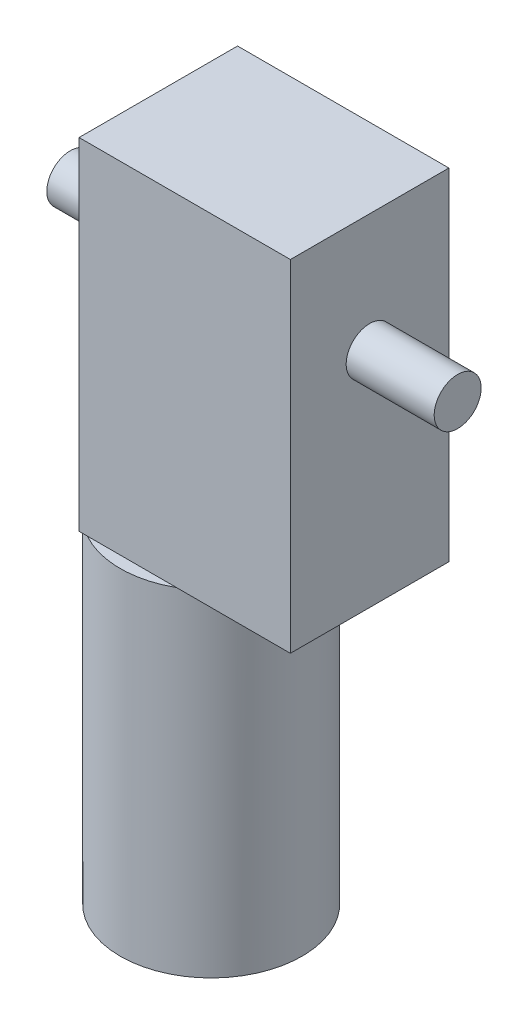
ISO-10303-21;
HEADER;
FILE_DESCRIPTION(('STEP AP214'),'2;1');
FILE_NAME('part.step','',(''),(''),'','','');
FILE_SCHEMA(('AUTOMOTIVE_DESIGN { 1 0 10303 214 1 1 1 1 }'));
ENDSEC;
DATA;
#1=APPLICATION_CONTEXT('core data for automotive mechanical design processes');
#2=APPLICATION_PROTOCOL_DEFINITION('international standard','automotive_design',2000,#1);
#3=PRODUCT_CONTEXT('',#1,'mechanical');
#4=PRODUCT('Part','Part','',(#3));
#5=PRODUCT_RELATED_PRODUCT_CATEGORY('part','',(#4));
#6=PRODUCT_DEFINITION_FORMATION('','',#4);
#7=PRODUCT_DEFINITION_CONTEXT('part definition',#1,'design');
#8=PRODUCT_DEFINITION('design','',#6,#7);
#9=PRODUCT_DEFINITION_SHAPE('','',#8);
#10=(LENGTH_UNIT() NAMED_UNIT(*) SI_UNIT(.MILLI.,.METRE.));
#11=(NAMED_UNIT(*) PLANE_ANGLE_UNIT() SI_UNIT($,.RADIAN.));
#12=(NAMED_UNIT(*) SI_UNIT($,.STERADIAN.) SOLID_ANGLE_UNIT());
#13=UNCERTAINTY_MEASURE_WITH_UNIT(LENGTH_MEASURE(1.E-05),#10,'distance_accuracy_value','');
#14=(GEOMETRIC_REPRESENTATION_CONTEXT(3) GLOBAL_UNCERTAINTY_ASSIGNED_CONTEXT((#13)) GLOBAL_UNIT_ASSIGNED_CONTEXT((#10,
#11,#12)) REPRESENTATION_CONTEXT('',''));
#15=CARTESIAN_POINT('',(0.,0.,0.));
#16=DIRECTION('',(0.,0.,1.));
#17=DIRECTION('',(1.,0.,0.));
#18=AXIS2_PLACEMENT_3D('',#15,#16,#17);
#19=CARTESIAN_POINT('',(0.,57.2,0.));
#20=DIRECTION('',(0.,1.,0.));
#21=DIRECTION('',(0.,0.,1.));
#22=AXIS2_PLACEMENT_3D('',#19,#20,#21);
#23=PLANE('',#22);
#24=DIRECTION('',(0.,0.,1.));
#25=VECTOR('',#24,1.);
#26=CARTESIAN_POINT('',(-9.00000000000001,57.2,-13.5));
#27=LINE('',#26,#25);
#28=CARTESIAN_POINT('',(-9.00000000000001,57.2,-12.6120591498772));
#29=VERTEX_POINT('',#28);
#30=CARTESIAN_POINT('',(-9.,57.2,12.6120591498772));
#31=VERTEX_POINT('',#30);
#32=EDGE_CURVE('E11',#29,#31,#27,.T.);
#33=ORIENTED_EDGE('',*,*,#32,.F.);
#34=CARTESIAN_POINT('',(0.,57.2,0.));
#35=DIRECTION('',(0.,1.,0.));
#36=DIRECTION('',(0.,0.,1.));
#37=AXIS2_PLACEMENT_3D('',#34,#35,#36);
#38=CIRCLE('',#37,15.494);
#39=EDGE_CURVE('E145',#29,#31,#38,.T.);
#40=ORIENTED_EDGE('',*,*,#39,.T.);
#41=EDGE_LOOP('',(#33,#40));
#42=FACE_BOUND('',#41,.T.);
#43=ADVANCED_FACE('F34',(#42),#23,.T.);
#44=DIRECTION('',(-1.,0.,0.));
#45=VECTOR('',#44,1.);
#46=CARTESIAN_POINT('',(-9.00000000000001,57.2,-13.5));
#47=LINE('',#46,#45);
#48=CARTESIAN_POINT('',(7.60355416893967,57.2,-13.5));
#49=VERTEX_POINT('',#48);
#50=CARTESIAN_POINT('',(-7.60355416893968,57.2,-13.5));
#51=VERTEX_POINT('',#50);
#52=EDGE_CURVE('E43',#49,#51,#47,.T.);
#53=ORIENTED_EDGE('',*,*,#52,.F.);
#54=EDGE_CURVE('E135',#49,#51,#38,.T.);
#55=ORIENTED_EDGE('',*,*,#54,.T.);
#56=EDGE_LOOP('',(#53,#55));
#57=FACE_BOUND('',#56,.T.);
#58=ADVANCED_FACE('F201',(#57),#23,.T.);
#59=CARTESIAN_POINT('',(0.,57.2,0.));
#60=DIRECTION('',(0.,-1.,0.));
#61=DIRECTION('',(0.,0.,-1.));
#62=AXIS2_PLACEMENT_3D('',#59,#60,#61);
#63=CYLINDRICAL_SURFACE('',#62,15.494);
#64=CARTESIAN_POINT('',(7.60355416893969,57.2,13.5));
#65=VERTEX_POINT('',#64);
#66=EDGE_CURVE('E133',#65,#49,#38,.T.);
#67=ORIENTED_EDGE('',*,*,#66,.F.);
#68=CARTESIAN_POINT('',(-7.60355416893969,57.2,13.5));
#69=VERTEX_POINT('',#68);
#70=EDGE_CURVE('E128',#69,#65,#38,.T.);
#71=ORIENTED_EDGE('',*,*,#70,.F.);
#72=EDGE_CURVE('E59',#31,#69,#38,.T.);
#73=ORIENTED_EDGE('',*,*,#72,.F.);
#74=ORIENTED_EDGE('',*,*,#39,.F.);
#75=EDGE_CURVE('E144',#51,#29,#38,.T.);
#76=ORIENTED_EDGE('',*,*,#75,.F.);
#77=ORIENTED_EDGE('',*,*,#54,.F.);
#78=EDGE_LOOP('',(#67,#71,#73,#74,#76,#77));
#79=FACE_BOUND('',#78,.T.);
#80=CARTESIAN_POINT('',(0.,0.,0.));
#81=DIRECTION('',(0.,1.,0.));
#82=DIRECTION('',(0.,0.,1.));
#83=AXIS2_PLACEMENT_3D('',#80,#81,#82);
#84=CIRCLE('',#83,15.494);
#85=CARTESIAN_POINT('',(0.,0.,15.494));
#86=VERTEX_POINT('',#85);
#87=EDGE_CURVE('E125',#86,#86,#84,.T.);
#88=ORIENTED_EDGE('',*,*,#87,.T.);
#89=EDGE_LOOP('',(#88));
#90=FACE_BOUND('',#89,.T.);
#91=ADVANCED_FACE('F36',(#79,#90),#63,.T.);
#92=DIRECTION('',(1.,0.,0.));
#93=VECTOR('',#92,1.);
#94=CARTESIAN_POINT('',(-9.,57.2,13.5));
#95=LINE('',#94,#93);
#96=EDGE_CURVE('E52',#69,#65,#95,.T.);
#97=ORIENTED_EDGE('',*,*,#96,.F.);
#98=ORIENTED_EDGE('',*,*,#70,.T.);
#99=EDGE_LOOP('',(#97,#98));
#100=FACE_BOUND('',#99,.T.);
#101=ADVANCED_FACE('F203',(#100),#23,.T.);
#102=CARTESIAN_POINT('',(0.,0.,0.));
#103=DIRECTION('',(0.,1.,0.));
#104=DIRECTION('',(0.,0.,1.));
#105=AXIS2_PLACEMENT_3D('',#102,#103,#104);
#106=PLANE('',#105);
#107=ORIENTED_EDGE('',*,*,#87,.F.);
#108=EDGE_LOOP('',(#107));
#109=FACE_BOUND('',#108,.T.);
#110=ADVANCED_FACE('F210',(#109),#106,.F.);
#111=CARTESIAN_POINT('',(0.,57.2,0.));
#112=DIRECTION('',(0.,1.,0.));
#113=DIRECTION('',(0.,0.,1.));
#114=AXIS2_PLACEMENT_3D('',#111,#112,#113);
#115=PLANE('',#114);
#116=CARTESIAN_POINT('',(27.,57.2,13.5));
#117=VERTEX_POINT('',#116);
#118=EDGE_CURVE('E142',#65,#117,#95,.T.);
#119=ORIENTED_EDGE('',*,*,#118,.F.);
#120=ORIENTED_EDGE('',*,*,#66,.T.);
#121=CARTESIAN_POINT('',(27.,57.2,-13.5));
#122=VERTEX_POINT('',#121);
#123=EDGE_CURVE('E119',#122,#49,#47,.T.);
#124=ORIENTED_EDGE('',*,*,#123,.F.);
#125=DIRECTION('',(0.,0.,-1.));
#126=VECTOR('',#125,1.);
#127=CARTESIAN_POINT('',(27.,57.2,-13.5));
#128=LINE('',#127,#126);
#129=EDGE_CURVE('E161',#117,#122,#128,.T.);
#130=ORIENTED_EDGE('',*,*,#129,.F.);
#131=EDGE_LOOP('',(#119,#120,#124,#130));
#132=FACE_BOUND('',#131,.T.);
#133=ADVANCED_FACE('F170',(#132),#115,.F.);
#134=CARTESIAN_POINT('',(-9.00000000000001,57.2,-13.5));
#135=VERTEX_POINT('',#134);
#136=EDGE_CURVE('E153',#51,#135,#47,.T.);
#137=ORIENTED_EDGE('',*,*,#136,.F.);
#138=ORIENTED_EDGE('',*,*,#75,.T.);
#139=EDGE_CURVE('E45',#135,#29,#27,.T.);
#140=ORIENTED_EDGE('',*,*,#139,.F.);
#141=EDGE_LOOP('',(#137,#138,#140));
#142=FACE_BOUND('',#141,.T.);
#143=ADVANCED_FACE('F152',(#142),#115,.F.);
#144=CARTESIAN_POINT('',(-9.,57.2,13.5));
#145=VERTEX_POINT('',#144);
#146=EDGE_CURVE('E46',#31,#145,#27,.T.);
#147=ORIENTED_EDGE('',*,*,#146,.F.);
#148=ORIENTED_EDGE('',*,*,#72,.T.);
#149=EDGE_CURVE('E141',#145,#69,#95,.T.);
#150=ORIENTED_EDGE('',*,*,#149,.F.);
#151=EDGE_LOOP('',(#147,#148,#150));
#152=FACE_BOUND('',#151,.T.);
#153=ADVANCED_FACE('F245',(#152),#115,.F.);
#154=CARTESIAN_POINT('',(-9.00000000000001,115.3,-13.5));
#155=DIRECTION('',(1.,0.,0.));
#156=DIRECTION('',(0.,0.,-1.));
#157=AXIS2_PLACEMENT_3D('',#154,#155,#156);
#158=PLANE('',#157);
#159=CARTESIAN_POINT('',(-9.,95.1,0.));
#160=DIRECTION('',(1.,0.,0.));
#161=DIRECTION('',(0.,0.,-1.));
#162=AXIS2_PLACEMENT_3D('',#159,#160,#161);
#163=CIRCLE('',#162,4.);
#164=CARTESIAN_POINT('',(-9.,95.1,-4.));
#165=VERTEX_POINT('',#164);
#166=EDGE_CURVE('E157',#165,#165,#163,.T.);
#167=ORIENTED_EDGE('',*,*,#166,.T.);
#168=EDGE_LOOP('',(#167));
#169=FACE_BOUND('',#168,.T.);
#170=ORIENTED_EDGE('',*,*,#139,.T.);
#171=ORIENTED_EDGE('',*,*,#32,.T.);
#172=ORIENTED_EDGE('',*,*,#146,.T.);
#173=DIRECTION('',(0.,-1.,0.));
#174=VECTOR('',#173,1.);
#175=CARTESIAN_POINT('',(-9.,115.3,13.5));
#176=LINE('',#175,#174);
#177=CARTESIAN_POINT('',(-9.,115.3,13.5));
#178=VERTEX_POINT('',#177);
#179=EDGE_CURVE('E104',#178,#145,#176,.T.);
#180=ORIENTED_EDGE('',*,*,#179,.F.);
#181=DIRECTION('',(0.,0.,1.));
#182=VECTOR('',#181,1.);
#183=CARTESIAN_POINT('',(-9.00000000000001,115.3,-13.5));
#184=LINE('',#183,#182);
#185=CARTESIAN_POINT('',(-9.00000000000001,115.3,-13.5));
#186=VERTEX_POINT('',#185);
#187=EDGE_CURVE('E110',#186,#178,#184,.T.);
#188=ORIENTED_EDGE('',*,*,#187,.F.);
#189=DIRECTION('',(0.,-1.,0.));
#190=VECTOR('',#189,1.);
#191=CARTESIAN_POINT('',(-9.00000000000001,115.3,-13.5));
#192=LINE('',#191,#190);
#193=EDGE_CURVE('E156',#186,#135,#192,.T.);
#194=ORIENTED_EDGE('',*,*,#193,.T.);
#195=EDGE_LOOP('',(#170,#171,#172,#180,#188,#194));
#196=FACE_BOUND('',#195,.T.);
#197=ADVANCED_FACE('F122',(#169,#196),#158,.F.);
#198=CARTESIAN_POINT('',(-9.,115.3,13.5));
#199=DIRECTION('',(0.,0.,-1.));
#200=DIRECTION('',(-1.,0.,0.));
#201=AXIS2_PLACEMENT_3D('',#198,#199,#200);
#202=PLANE('',#201);
#203=ORIENTED_EDGE('',*,*,#149,.T.);
#204=ORIENTED_EDGE('',*,*,#96,.T.);
#205=ORIENTED_EDGE('',*,*,#118,.T.);
#206=DIRECTION('',(0.,-1.,0.));
#207=VECTOR('',#206,1.);
#208=CARTESIAN_POINT('',(27.,115.3,13.5));
#209=LINE('',#208,#207);
#210=CARTESIAN_POINT('',(27.,115.3,13.5));
#211=VERTEX_POINT('',#210);
#212=EDGE_CURVE('E106',#211,#117,#209,.T.);
#213=ORIENTED_EDGE('',*,*,#212,.F.);
#214=DIRECTION('',(1.,0.,0.));
#215=VECTOR('',#214,1.);
#216=CARTESIAN_POINT('',(-9.,115.3,13.5));
#217=LINE('',#216,#215);
#218=EDGE_CURVE('E99',#178,#211,#217,.T.);
#219=ORIENTED_EDGE('',*,*,#218,.F.);
#220=ORIENTED_EDGE('',*,*,#179,.T.);
#221=EDGE_LOOP('',(#203,#204,#205,#213,#219,#220));
#222=FACE_BOUND('',#221,.T.);
#223=ADVANCED_FACE('F102',(#222),#202,.F.);
#224=CARTESIAN_POINT('',(27.,115.3,-13.5));
#225=DIRECTION('',(-1.,0.,0.));
#226=DIRECTION('',(0.,0.,1.));
#227=AXIS2_PLACEMENT_3D('',#224,#225,#226);
#228=PLANE('',#227);
#229=CARTESIAN_POINT('',(27.,95.1,0.));
#230=DIRECTION('',(-1.,0.,0.));
#231=DIRECTION('',(0.,0.,1.));
#232=AXIS2_PLACEMENT_3D('',#229,#230,#231);
#233=CIRCLE('',#232,4.);
#234=CARTESIAN_POINT('',(27.,95.1,4.));
#235=VERTEX_POINT('',#234);
#236=EDGE_CURVE('E38',#235,#235,#233,.T.);
#237=ORIENTED_EDGE('',*,*,#236,.T.);
#238=EDGE_LOOP('',(#237));
#239=FACE_BOUND('',#238,.T.);
#240=ORIENTED_EDGE('',*,*,#129,.T.);
#241=DIRECTION('',(0.,-1.,0.));
#242=VECTOR('',#241,1.);
#243=CARTESIAN_POINT('',(27.,115.3,-13.5));
#244=LINE('',#243,#242);
#245=CARTESIAN_POINT('',(27.,115.3,-13.5));
#246=VERTEX_POINT('',#245);
#247=EDGE_CURVE('E129',#246,#122,#244,.T.);
#248=ORIENTED_EDGE('',*,*,#247,.F.);
#249=DIRECTION('',(0.,0.,-1.));
#250=VECTOR('',#249,1.);
#251=CARTESIAN_POINT('',(27.,115.3,-13.5));
#252=LINE('',#251,#250);
#253=EDGE_CURVE('E109',#211,#246,#252,.T.);
#254=ORIENTED_EDGE('',*,*,#253,.F.);
#255=ORIENTED_EDGE('',*,*,#212,.T.);
#256=EDGE_LOOP('',(#240,#248,#254,#255));
#257=FACE_BOUND('',#256,.T.);
#258=ADVANCED_FACE('F171',(#239,#257),#228,.F.);
#259=CARTESIAN_POINT('',(-9.00000000000001,115.3,-13.5));
#260=DIRECTION('',(0.,0.,1.));
#261=DIRECTION('',(1.,0.,0.));
#262=AXIS2_PLACEMENT_3D('',#259,#260,#261);
#263=PLANE('',#262);
#264=ORIENTED_EDGE('',*,*,#123,.T.);
#265=ORIENTED_EDGE('',*,*,#52,.T.);
#266=ORIENTED_EDGE('',*,*,#136,.T.);
#267=ORIENTED_EDGE('',*,*,#193,.F.);
#268=DIRECTION('',(-1.,0.,0.));
#269=VECTOR('',#268,1.);
#270=CARTESIAN_POINT('',(-9.00000000000001,115.3,-13.5));
#271=LINE('',#270,#269);
#272=EDGE_CURVE('E115',#246,#186,#271,.T.);
#273=ORIENTED_EDGE('',*,*,#272,.F.);
#274=ORIENTED_EDGE('',*,*,#247,.T.);
#275=EDGE_LOOP('',(#264,#265,#266,#267,#273,#274));
#276=FACE_BOUND('',#275,.T.);
#277=ADVANCED_FACE('F167',(#276),#263,.F.);
#278=CARTESIAN_POINT('',(0.,115.3,0.));
#279=DIRECTION('',(0.,1.,0.));
#280=DIRECTION('',(0.,0.,1.));
#281=AXIS2_PLACEMENT_3D('',#278,#279,#280);
#282=PLANE('',#281);
#283=ORIENTED_EDGE('',*,*,#187,.T.);
#284=ORIENTED_EDGE('',*,*,#218,.T.);
#285=ORIENTED_EDGE('',*,*,#253,.T.);
#286=ORIENTED_EDGE('',*,*,#272,.T.);
#287=EDGE_LOOP('',(#283,#284,#285,#286));
#288=FACE_BOUND('',#287,.T.);
#289=ADVANCED_FACE('F113',(#288),#282,.T.);
#290=CARTESIAN_POINT('',(42.,95.1,0.));
#291=DIRECTION('',(1.,0.,0.));
#292=DIRECTION('',(0.,0.,-1.));
#293=AXIS2_PLACEMENT_3D('',#290,#291,#292);
#294=PLANE('',#293);
#295=CARTESIAN_POINT('',(42.,95.1,0.));
#296=DIRECTION('',(1.,0.,0.));
#297=DIRECTION('',(0.,0.,-1.));
#298=AXIS2_PLACEMENT_3D('',#295,#296,#297);
#299=CIRCLE('',#298,4.);
#300=CARTESIAN_POINT('',(42.,95.1,-4.));
#301=VERTEX_POINT('',#300);
#302=EDGE_CURVE('E178',#301,#301,#299,.T.);
#303=ORIENTED_EDGE('',*,*,#302,.T.);
#304=EDGE_LOOP('',(#303));
#305=FACE_BOUND('',#304,.T.);
#306=ADVANCED_FACE('F182',(#305),#294,.T.);
#307=CARTESIAN_POINT('',(-24.,95.1,0.));
#308=DIRECTION('',(1.,0.,0.));
#309=DIRECTION('',(0.,0.,-1.));
#310=AXIS2_PLACEMENT_3D('',#307,#308,#309);
#311=CYLINDRICAL_SURFACE('',#310,4.);
#312=ORIENTED_EDGE('',*,*,#302,.F.);
#313=EDGE_LOOP('',(#312));
#314=FACE_BOUND('',#313,.T.);
#315=ORIENTED_EDGE('',*,*,#236,.F.);
#316=EDGE_LOOP('',(#315));
#317=FACE_BOUND('',#316,.T.);
#318=ADVANCED_FACE('F184',(#314,#317),#311,.T.);
#319=CARTESIAN_POINT('',(-24.,95.1,0.));
#320=DIRECTION('',(1.,0.,0.));
#321=DIRECTION('',(0.,0.,-1.));
#322=AXIS2_PLACEMENT_3D('',#319,#320,#321);
#323=CIRCLE('',#322,4.);
#324=CARTESIAN_POINT('',(-24.,95.1,-4.));
#325=VERTEX_POINT('',#324);
#326=EDGE_CURVE('E175',#325,#325,#323,.T.);
#327=ORIENTED_EDGE('',*,*,#326,.T.);
#328=EDGE_LOOP('',(#327));
#329=FACE_BOUND('',#328,.T.);
#330=ORIENTED_EDGE('',*,*,#166,.F.);
#331=EDGE_LOOP('',(#330));
#332=FACE_BOUND('',#331,.T.);
#333=ADVANCED_FACE('F187',(#329,#332),#311,.T.);
#334=CARTESIAN_POINT('',(-24.,95.1,0.));
#335=DIRECTION('',(1.,0.,0.));
#336=DIRECTION('',(0.,0.,-1.));
#337=AXIS2_PLACEMENT_3D('',#334,#335,#336);
#338=PLANE('',#337);
#339=ORIENTED_EDGE('',*,*,#326,.F.);
#340=EDGE_LOOP('',(#339));
#341=FACE_BOUND('',#340,.T.);
#342=ADVANCED_FACE('F297',(#341),#338,.F.);
#343=CLOSED_SHELL('',(#43,#58,#91,#101,#110,#133,#143,#153,#197,#223,#258,#277,#289,#306,#318,
#333,#342));
#344=MANIFOLD_SOLID_BREP('B2',#343);
#345=ADVANCED_BREP_SHAPE_REPRESENTATION('',(#18,#344),#14);
#346=SHAPE_DEFINITION_REPRESENTATION(#9,#345);
ENDSEC;
END-ISO-10303-21;
